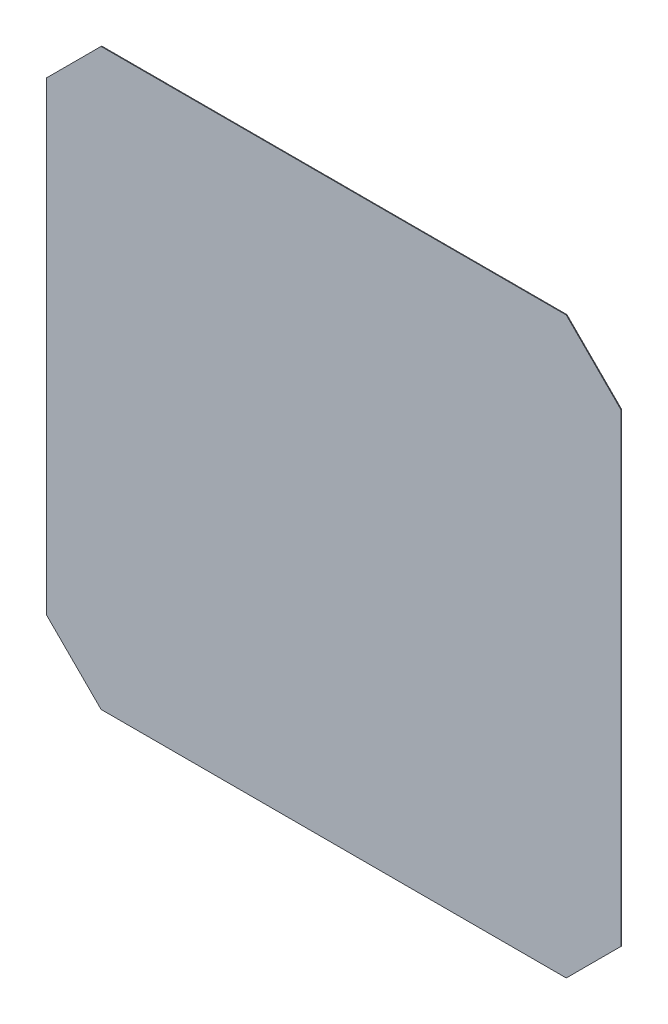
ISO-10303-21;
HEADER;
FILE_DESCRIPTION(('STEP AP214'),'2;1');
FILE_NAME('part.step','',(''),(''),'','','');
FILE_SCHEMA(('AUTOMOTIVE_DESIGN { 1 0 10303 214 1 1 1 1 }'));
ENDSEC;
DATA;
#1=APPLICATION_CONTEXT('core data for automotive mechanical design processes');
#2=APPLICATION_PROTOCOL_DEFINITION('international standard','automotive_design',2000,#1);
#3=PRODUCT_CONTEXT('',#1,'mechanical');
#4=PRODUCT('Part','Part','',(#3));
#5=PRODUCT_RELATED_PRODUCT_CATEGORY('part','',(#4));
#6=PRODUCT_DEFINITION_FORMATION('','',#4);
#7=PRODUCT_DEFINITION_CONTEXT('part definition',#1,'design');
#8=PRODUCT_DEFINITION('design','',#6,#7);
#9=PRODUCT_DEFINITION_SHAPE('','',#8);
#10=(LENGTH_UNIT() NAMED_UNIT(*) SI_UNIT(.MILLI.,.METRE.));
#11=(NAMED_UNIT(*) PLANE_ANGLE_UNIT() SI_UNIT($,.RADIAN.));
#12=(NAMED_UNIT(*) SI_UNIT($,.STERADIAN.) SOLID_ANGLE_UNIT());
#13=UNCERTAINTY_MEASURE_WITH_UNIT(LENGTH_MEASURE(1.E-05),#10,'distance_accuracy_value','');
#14=(GEOMETRIC_REPRESENTATION_CONTEXT(3) GLOBAL_UNCERTAINTY_ASSIGNED_CONTEXT((#13)) GLOBAL_UNIT_ASSIGNED_CONTEXT((#10,
#11,#12)) REPRESENTATION_CONTEXT('',''));
#15=CARTESIAN_POINT('',(0.,0.,0.));
#16=DIRECTION('',(0.,0.,1.));
#17=DIRECTION('',(1.,0.,0.));
#18=AXIS2_PLACEMENT_3D('',#15,#16,#17);
#19=CARTESIAN_POINT('',(0.,0.,0.));
#20=DIRECTION('',(0.,0.,-1.));
#21=DIRECTION('',(-1.,0.,0.));
#22=AXIS2_PLACEMENT_3D('',#19,#20,#21);
#23=PLANE('',#22);
#24=DIRECTION('',(0.,-1.,0.));
#25=VECTOR('',#24,1.);
#26=CARTESIAN_POINT('',(-40.,-57.1,0.));
#27=LINE('',#26,#25);
#28=CARTESIAN_POINT('',(-40.,-57.1,0.));
#29=VERTEX_POINT('',#28);
#30=CARTESIAN_POINT('',(-40.,-62.5,0.));
#31=VERTEX_POINT('',#30);
#32=EDGE_CURVE('E259',#29,#31,#27,.T.);
#33=ORIENTED_EDGE('',*,*,#32,.T.);
#34=DIRECTION('',(1.,0.,0.));
#35=VECTOR('',#34,1.);
#36=CARTESIAN_POINT('',(-62.5,-62.5,0.));
#37=LINE('',#36,#35);
#38=CARTESIAN_POINT('',(-50.6370849898476,-62.5,0.));
#39=VERTEX_POINT('',#38);
#40=EDGE_CURVE('E45',#39,#31,#37,.T.);
#41=ORIENTED_EDGE('',*,*,#40,.F.);
#42=DIRECTION('',(0.707106781186547,-0.707106781186548,0.));
#43=VECTOR('',#42,1.);
#44=CARTESIAN_POINT('',(-62.5000000000006,-50.637084989847,0.));
#45=LINE('',#44,#43);
#46=CARTESIAN_POINT('',(-62.5,-50.6370849898476,0.));
#47=VERTEX_POINT('',#46);
#48=EDGE_CURVE('E525',#47,#39,#45,.T.);
#49=ORIENTED_EDGE('',*,*,#48,.F.);
#50=DIRECTION('',(0.,-1.,0.));
#51=VECTOR('',#50,1.);
#52=CARTESIAN_POINT('',(-62.5,-62.5,0.));
#53=LINE('',#52,#51);
#54=CARTESIAN_POINT('',(-62.5000000000006,50.637084989847,0.));
#55=VERTEX_POINT('',#54);
#56=EDGE_CURVE('E571',#55,#47,#53,.T.);
#57=ORIENTED_EDGE('',*,*,#56,.F.);
#58=DIRECTION('',(0.707106781186547,0.707106781186548,0.));
#59=VECTOR('',#58,1.);
#60=CARTESIAN_POINT('',(-62.5000000000006,50.637084989847,0.));
#61=LINE('',#60,#59);
#62=CARTESIAN_POINT('',(-50.6370849898476,62.5,0.));
#63=VERTEX_POINT('',#62);
#64=EDGE_CURVE('E539',#55,#63,#61,.T.);
#65=ORIENTED_EDGE('',*,*,#64,.T.);
#66=DIRECTION('',(-1.,0.,0.));
#67=VECTOR('',#66,1.);
#68=CARTESIAN_POINT('',(-62.5,62.5,0.));
#69=LINE('',#68,#67);
#70=CARTESIAN_POINT('',(-40.,62.5,0.));
#71=VERTEX_POINT('',#70);
#72=EDGE_CURVE('E567',#71,#63,#69,.T.);
#73=ORIENTED_EDGE('',*,*,#72,.F.);
#74=DIRECTION('',(0.,1.,0.));
#75=VECTOR('',#74,1.);
#76=CARTESIAN_POINT('',(-40.,57.1,0.));
#77=LINE('',#76,#75);
#78=CARTESIAN_POINT('',(-40.,57.1,0.));
#79=VERTEX_POINT('',#78);
#80=EDGE_CURVE('E381',#79,#71,#77,.T.);
#81=ORIENTED_EDGE('',*,*,#80,.F.);
#82=DIRECTION('',(-1.,0.,0.));
#83=VECTOR('',#82,1.);
#84=CARTESIAN_POINT('',(-37.,57.1,0.));
#85=LINE('',#84,#83);
#86=CARTESIAN_POINT('',(-37.,57.1,0.));
#87=VERTEX_POINT('',#86);
#88=EDGE_CURVE('E387',#87,#79,#85,.T.);
#89=ORIENTED_EDGE('',*,*,#88,.F.);
#90=DIRECTION('',(0.,-1.,0.));
#91=VECTOR('',#90,1.);
#92=CARTESIAN_POINT('',(-37.,57.1,0.));
#93=LINE('',#92,#91);
#94=CARTESIAN_POINT('',(-37.,62.5,0.));
#95=VERTEX_POINT('',#94);
#96=EDGE_CURVE('E399',#95,#87,#93,.T.);
#97=ORIENTED_EDGE('',*,*,#96,.F.);
#98=CARTESIAN_POINT('',(-1.49999999999999,62.5,0.));
#99=VERTEX_POINT('',#98);
#100=EDGE_CURVE('E573',#99,#95,#69,.T.);
#101=ORIENTED_EDGE('',*,*,#100,.F.);
#102=DIRECTION('',(0.,1.,0.));
#103=VECTOR('',#102,1.);
#104=CARTESIAN_POINT('',(-1.49999999999999,57.1,0.));
#105=LINE('',#104,#103);
#106=CARTESIAN_POINT('',(-1.49999999999999,57.1,0.));
#107=VERTEX_POINT('',#106);
#108=EDGE_CURVE('E455',#107,#99,#105,.T.);
#109=ORIENTED_EDGE('',*,*,#108,.F.);
#110=DIRECTION('',(-1.,0.,0.));
#111=VECTOR('',#110,1.);
#112=CARTESIAN_POINT('',(1.50000000000001,57.1,0.));
#113=LINE('',#112,#111);
#114=CARTESIAN_POINT('',(1.50000000000001,57.1,0.));
#115=VERTEX_POINT('',#114);
#116=EDGE_CURVE('E461',#115,#107,#113,.T.);
#117=ORIENTED_EDGE('',*,*,#116,.F.);
#118=DIRECTION('',(0.,-1.,0.));
#119=VECTOR('',#118,1.);
#120=CARTESIAN_POINT('',(1.50000000000001,57.1,0.));
#121=LINE('',#120,#119);
#122=CARTESIAN_POINT('',(1.50000000000001,62.5,0.));
#123=VERTEX_POINT('',#122);
#124=EDGE_CURVE('E474',#123,#115,#121,.T.);
#125=ORIENTED_EDGE('',*,*,#124,.F.);
#126=CARTESIAN_POINT('',(37.,62.5,0.));
#127=VERTEX_POINT('',#126);
#128=EDGE_CURVE('E572',#127,#123,#69,.T.);
#129=ORIENTED_EDGE('',*,*,#128,.F.);
#130=DIRECTION('',(0.,1.,0.));
#131=VECTOR('',#130,1.);
#132=CARTESIAN_POINT('',(37.,57.1,0.));
#133=LINE('',#132,#131);
#134=CARTESIAN_POINT('',(37.,57.1,0.));
#135=VERTEX_POINT('',#134);
#136=EDGE_CURVE('E418',#135,#127,#133,.T.);
#137=ORIENTED_EDGE('',*,*,#136,.F.);
#138=DIRECTION('',(-1.,0.,0.));
#139=VECTOR('',#138,1.);
#140=CARTESIAN_POINT('',(40.,57.1,0.));
#141=LINE('',#140,#139);
#142=CARTESIAN_POINT('',(40.,57.1,0.));
#143=VERTEX_POINT('',#142);
#144=EDGE_CURVE('E424',#143,#135,#141,.T.);
#145=ORIENTED_EDGE('',*,*,#144,.F.);
#146=DIRECTION('',(0.,-1.,0.));
#147=VECTOR('',#146,1.);
#148=CARTESIAN_POINT('',(40.,57.1,0.));
#149=LINE('',#148,#147);
#150=CARTESIAN_POINT('',(40.,62.5,0.));
#151=VERTEX_POINT('',#150);
#152=EDGE_CURVE('E436',#151,#143,#149,.T.);
#153=ORIENTED_EDGE('',*,*,#152,.F.);
#154=CARTESIAN_POINT('',(50.6370849898476,62.5,0.));
#155=VERTEX_POINT('',#154);
#156=EDGE_CURVE('E568',#155,#151,#69,.T.);
#157=ORIENTED_EDGE('',*,*,#156,.F.);
#158=DIRECTION('',(-0.707106781186547,0.707106781186548,0.));
#159=VECTOR('',#158,1.);
#160=CARTESIAN_POINT('',(62.5000000000006,50.637084989847,0.));
#161=LINE('',#160,#159);
#162=CARTESIAN_POINT('',(62.5000000000006,50.637084989847,0.));
#163=VERTEX_POINT('',#162);
#164=EDGE_CURVE('E497',#163,#155,#161,.T.);
#165=ORIENTED_EDGE('',*,*,#164,.F.);
#166=DIRECTION('',(0.,1.,0.));
#167=VECTOR('',#166,1.);
#168=CARTESIAN_POINT('',(62.5,-62.5,0.));
#169=LINE('',#168,#167);
#170=CARTESIAN_POINT('',(62.5,-50.637084989847,0.));
#171=VERTEX_POINT('',#170);
#172=EDGE_CURVE('E551',#171,#163,#169,.T.);
#173=ORIENTED_EDGE('',*,*,#172,.F.);
#174=DIRECTION('',(-0.707106781186547,-0.707106781186548,0.));
#175=VECTOR('',#174,1.);
#176=CARTESIAN_POINT('',(62.5000000000006,-50.637084989847,0.));
#177=LINE('',#176,#175);
#178=CARTESIAN_POINT('',(50.6370849898476,-62.5,0.));
#179=VERTEX_POINT('',#178);
#180=EDGE_CURVE('E511',#171,#179,#177,.T.);
#181=ORIENTED_EDGE('',*,*,#180,.T.);
#182=CARTESIAN_POINT('',(40.,-62.5,0.));
#183=VERTEX_POINT('',#182);
#184=EDGE_CURVE('E576',#183,#179,#37,.T.);
#185=ORIENTED_EDGE('',*,*,#184,.F.);
#186=DIRECTION('',(0.,1.,0.));
#187=VECTOR('',#186,1.);
#188=CARTESIAN_POINT('',(40.,-57.1,0.));
#189=LINE('',#188,#187);
#190=CARTESIAN_POINT('',(40.,-57.1,0.));
#191=VERTEX_POINT('',#190);
#192=EDGE_CURVE('E67',#183,#191,#189,.T.);
#193=ORIENTED_EDGE('',*,*,#192,.T.);
#194=DIRECTION('',(-1.,0.,0.));
#195=VECTOR('',#194,1.);
#196=CARTESIAN_POINT('',(40.,-57.1,0.));
#197=LINE('',#196,#195);
#198=CARTESIAN_POINT('',(37.,-57.1,0.));
#199=VERTEX_POINT('',#198);
#200=EDGE_CURVE('E322',#191,#199,#197,.T.);
#201=ORIENTED_EDGE('',*,*,#200,.T.);
#202=DIRECTION('',(0.,-1.,0.));
#203=VECTOR('',#202,1.);
#204=CARTESIAN_POINT('',(37.,-57.1,0.));
#205=LINE('',#204,#203);
#206=CARTESIAN_POINT('',(37.,-62.5,0.));
#207=VERTEX_POINT('',#206);
#208=EDGE_CURVE('E265',#199,#207,#205,.T.);
#209=ORIENTED_EDGE('',*,*,#208,.T.);
#210=CARTESIAN_POINT('',(1.50000000000001,-62.5,0.));
#211=VERTEX_POINT('',#210);
#212=EDGE_CURVE('E581',#211,#207,#37,.T.);
#213=ORIENTED_EDGE('',*,*,#212,.F.);
#214=DIRECTION('',(0.,1.,0.));
#215=VECTOR('',#214,1.);
#216=CARTESIAN_POINT('',(1.50000000000001,-57.1,0.));
#217=LINE('',#216,#215);
#218=CARTESIAN_POINT('',(1.50000000000001,-57.1,0.));
#219=VERTEX_POINT('',#218);
#220=EDGE_CURVE('E345',#211,#219,#217,.T.);
#221=ORIENTED_EDGE('',*,*,#220,.T.);
#222=DIRECTION('',(-1.,0.,0.));
#223=VECTOR('',#222,1.);
#224=CARTESIAN_POINT('',(1.50000000000001,-57.1,0.));
#225=LINE('',#224,#223);
#226=CARTESIAN_POINT('',(-1.49999999999999,-57.1,0.));
#227=VERTEX_POINT('',#226);
#228=EDGE_CURVE('E361',#219,#227,#225,.T.);
#229=ORIENTED_EDGE('',*,*,#228,.T.);
#230=DIRECTION('',(0.,-1.,0.));
#231=VECTOR('',#230,1.);
#232=CARTESIAN_POINT('',(-1.49999999999999,-57.1,0.));
#233=LINE('',#232,#231);
#234=CARTESIAN_POINT('',(-1.49999999999999,-62.5,0.));
#235=VERTEX_POINT('',#234);
#236=EDGE_CURVE('E339',#227,#235,#233,.T.);
#237=ORIENTED_EDGE('',*,*,#236,.T.);
#238=CARTESIAN_POINT('',(-37.,-62.5,0.));
#239=VERTEX_POINT('',#238);
#240=EDGE_CURVE('E582',#239,#235,#37,.T.);
#241=ORIENTED_EDGE('',*,*,#240,.F.);
#242=DIRECTION('',(0.,1.,0.));
#243=VECTOR('',#242,1.);
#244=CARTESIAN_POINT('',(-37.,-57.1,0.));
#245=LINE('',#244,#243);
#246=CARTESIAN_POINT('',(-37.,-57.1,0.));
#247=VERTEX_POINT('',#246);
#248=EDGE_CURVE('E59',#239,#247,#245,.T.);
#249=ORIENTED_EDGE('',*,*,#248,.T.);
#250=DIRECTION('',(-1.,0.,0.));
#251=VECTOR('',#250,1.);
#252=CARTESIAN_POINT('',(-37.,-57.1,0.));
#253=LINE('',#252,#251);
#254=EDGE_CURVE('E290',#247,#29,#253,.T.);
#255=ORIENTED_EDGE('',*,*,#254,.T.);
#256=EDGE_LOOP('',(#33,#41,#49,#57,#65,#73,#81,#89,#97,#101,#109,#117,#125,#129,#137,#145,#153,
#157,#165,#173,#181,#185,#193,#201,#209,#213,#221,#229,#237,#241,#249,#255));
#257=FACE_BOUND('',#256,.T.);
#258=ADVANCED_FACE('F41',(#257),#23,.T.);
#259=CARTESIAN_POINT('',(0.,0.,0.15));
#260=DIRECTION('',(0.,0.,-1.));
#261=DIRECTION('',(-1.,0.,0.));
#262=AXIS2_PLACEMENT_3D('',#259,#260,#261);
#263=PLANE('',#262);
#264=DIRECTION('',(-0.707106781186547,0.707106781186548,0.));
#265=VECTOR('',#264,1.);
#266=CARTESIAN_POINT('',(62.5000000000006,50.637084989847,0.15));
#267=LINE('',#266,#265);
#268=CARTESIAN_POINT('',(62.5000000000006,50.637084989847,0.15));
#269=VERTEX_POINT('',#268);
#270=CARTESIAN_POINT('',(50.6370849898476,62.5,0.15));
#271=VERTEX_POINT('',#270);
#272=EDGE_CURVE('E496',#269,#271,#267,.T.);
#273=ORIENTED_EDGE('',*,*,#272,.T.);
#274=DIRECTION('',(-1.,0.,0.));
#275=VECTOR('',#274,1.);
#276=CARTESIAN_POINT('',(-62.5,62.5,0.15));
#277=LINE('',#276,#275);
#278=CARTESIAN_POINT('',(-50.6370849898476,62.5,0.15));
#279=VERTEX_POINT('',#278);
#280=EDGE_CURVE('E558',#271,#279,#277,.T.);
#281=ORIENTED_EDGE('',*,*,#280,.T.);
#282=DIRECTION('',(0.707106781186547,0.707106781186548,0.));
#283=VECTOR('',#282,1.);
#284=CARTESIAN_POINT('',(-62.5000000000006,50.637084989847,0.15));
#285=LINE('',#284,#283);
#286=CARTESIAN_POINT('',(-62.5000000000006,50.637084989847,0.15));
#287=VERTEX_POINT('',#286);
#288=EDGE_CURVE('E536',#287,#279,#285,.T.);
#289=ORIENTED_EDGE('',*,*,#288,.F.);
#290=DIRECTION('',(0.,-1.,0.));
#291=VECTOR('',#290,1.);
#292=CARTESIAN_POINT('',(-62.5,-62.5,0.15));
#293=LINE('',#292,#291);
#294=CARTESIAN_POINT('',(-62.5000000000006,-50.637084989847,0.15));
#295=VERTEX_POINT('',#294);
#296=EDGE_CURVE('E51',#287,#295,#293,.T.);
#297=ORIENTED_EDGE('',*,*,#296,.T.);
#298=DIRECTION('',(0.707106781186547,-0.707106781186548,0.));
#299=VECTOR('',#298,1.);
#300=CARTESIAN_POINT('',(-62.5000000000006,-50.637084989847,0.15));
#301=LINE('',#300,#299);
#302=CARTESIAN_POINT('',(-50.6370849898476,-62.5,0.15));
#303=VERTEX_POINT('',#302);
#304=EDGE_CURVE('E522',#295,#303,#301,.T.);
#305=ORIENTED_EDGE('',*,*,#304,.T.);
#306=DIRECTION('',(1.,0.,0.));
#307=VECTOR('',#306,1.);
#308=CARTESIAN_POINT('',(-62.5,-62.5,0.15));
#309=LINE('',#308,#307);
#310=CARTESIAN_POINT('',(50.6370849898476,-62.5,0.15));
#311=VERTEX_POINT('',#310);
#312=EDGE_CURVE('E11',#303,#311,#309,.T.);
#313=ORIENTED_EDGE('',*,*,#312,.T.);
#314=DIRECTION('',(-0.707106781186547,-0.707106781186548,0.));
#315=VECTOR('',#314,1.);
#316=CARTESIAN_POINT('',(62.5000000000006,-50.637084989847,0.15));
#317=LINE('',#316,#315);
#318=CARTESIAN_POINT('',(62.5000000000006,-50.637084989847,0.15));
#319=VERTEX_POINT('',#318);
#320=EDGE_CURVE('E508',#319,#311,#317,.T.);
#321=ORIENTED_EDGE('',*,*,#320,.F.);
#322=DIRECTION('',(0.,1.,0.));
#323=VECTOR('',#322,1.);
#324=CARTESIAN_POINT('',(62.5,-62.5,0.15));
#325=LINE('',#324,#323);
#326=EDGE_CURVE('E554',#319,#269,#325,.T.);
#327=ORIENTED_EDGE('',*,*,#326,.T.);
#328=EDGE_LOOP('',(#273,#281,#289,#297,#305,#313,#321,#327));
#329=FACE_BOUND('',#328,.T.);
#330=ADVANCED_FACE('F631',(#329),#263,.F.);
#331=CARTESIAN_POINT('',(62.5,-62.5,0.15));
#332=DIRECTION('',(-1.,0.,0.));
#333=DIRECTION('',(0.,0.,1.));
#334=AXIS2_PLACEMENT_3D('',#331,#332,#333);
#335=PLANE('',#334);
#336=DIRECTION('',(0.,0.,1.));
#337=VECTOR('',#336,1.);
#338=CARTESIAN_POINT('',(62.5000000000006,50.637084989847,0.));
#339=LINE('',#338,#337);
#340=EDGE_CURVE('E504',#163,#269,#339,.T.);
#341=ORIENTED_EDGE('',*,*,#340,.T.);
#342=ORIENTED_EDGE('',*,*,#326,.F.);
#343=DIRECTION('',(0.,0.,1.));
#344=VECTOR('',#343,1.);
#345=CARTESIAN_POINT('',(62.5000000000006,-50.637084989847,0.));
#346=LINE('',#345,#344);
#347=EDGE_CURVE('E515',#171,#319,#346,.T.);
#348=ORIENTED_EDGE('',*,*,#347,.F.);
#349=ORIENTED_EDGE('',*,*,#172,.T.);
#350=EDGE_LOOP('',(#341,#342,#348,#349));
#351=FACE_BOUND('',#350,.T.);
#352=ADVANCED_FACE('F43',(#351),#335,.F.);
#353=CARTESIAN_POINT('',(-62.5,62.5,0.15));
#354=DIRECTION('',(0.,-1.,0.));
#355=DIRECTION('',(0.,0.,-1.));
#356=AXIS2_PLACEMENT_3D('',#353,#354,#355);
#357=PLANE('',#356);
#358=ORIENTED_EDGE('',*,*,#128,.T.);
#359=DIRECTION('',(0.,0.,1.));
#360=VECTOR('',#359,1.);
#361=CARTESIAN_POINT('',(1.50000000000001,62.5,-0.01));
#362=LINE('',#361,#360);
#363=CARTESIAN_POINT('',(1.50000000000001,62.5,-0.01));
#364=VERTEX_POINT('',#363);
#365=EDGE_CURVE('E488',#364,#123,#362,.T.);
#366=ORIENTED_EDGE('',*,*,#365,.F.);
#367=DIRECTION('',(1.,0.,0.));
#368=VECTOR('',#367,1.);
#369=CARTESIAN_POINT('',(1.50000000000001,62.5,-0.01));
#370=LINE('',#369,#368);
#371=CARTESIAN_POINT('',(-1.49999999999999,62.5,-0.01));
#372=VERTEX_POINT('',#371);
#373=EDGE_CURVE('E460',#372,#364,#370,.T.);
#374=ORIENTED_EDGE('',*,*,#373,.F.);
#375=DIRECTION('',(0.,0.,1.));
#376=VECTOR('',#375,1.);
#377=CARTESIAN_POINT('',(-1.49999999999999,62.5,-0.01));
#378=LINE('',#377,#376);
#379=EDGE_CURVE('E492',#372,#99,#378,.T.);
#380=ORIENTED_EDGE('',*,*,#379,.T.);
#381=ORIENTED_EDGE('',*,*,#100,.T.);
#382=DIRECTION('',(0.,0.,1.));
#383=VECTOR('',#382,1.);
#384=CARTESIAN_POINT('',(-37.,62.5,-0.01));
#385=LINE('',#384,#383);
#386=CARTESIAN_POINT('',(-37.,62.5,-0.01));
#387=VERTEX_POINT('',#386);
#388=EDGE_CURVE('E411',#387,#95,#385,.T.);
#389=ORIENTED_EDGE('',*,*,#388,.F.);
#390=DIRECTION('',(1.,0.,0.));
#391=VECTOR('',#390,1.);
#392=CARTESIAN_POINT('',(-37.,62.5,-0.01));
#393=LINE('',#392,#391);
#394=CARTESIAN_POINT('',(-40.,62.5,-0.01));
#395=VERTEX_POINT('',#394);
#396=EDGE_CURVE('E386',#395,#387,#393,.T.);
#397=ORIENTED_EDGE('',*,*,#396,.F.);
#398=DIRECTION('',(0.,0.,1.));
#399=VECTOR('',#398,1.);
#400=CARTESIAN_POINT('',(-40.,62.5,-0.01));
#401=LINE('',#400,#399);
#402=EDGE_CURVE('E414',#395,#71,#401,.T.);
#403=ORIENTED_EDGE('',*,*,#402,.T.);
#404=ORIENTED_EDGE('',*,*,#72,.T.);
#405=DIRECTION('',(0.,0.,1.));
#406=VECTOR('',#405,1.);
#407=CARTESIAN_POINT('',(-50.6370849898476,62.5,0.));
#408=LINE('',#407,#406);
#409=EDGE_CURVE('E547',#63,#279,#408,.T.);
#410=ORIENTED_EDGE('',*,*,#409,.T.);
#411=ORIENTED_EDGE('',*,*,#280,.F.);
#412=DIRECTION('',(0.,0.,1.));
#413=VECTOR('',#412,1.);
#414=CARTESIAN_POINT('',(50.6370849898476,62.5,0.));
#415=LINE('',#414,#413);
#416=EDGE_CURVE('E500',#155,#271,#415,.T.);
#417=ORIENTED_EDGE('',*,*,#416,.F.);
#418=ORIENTED_EDGE('',*,*,#156,.T.);
#419=DIRECTION('',(0.,0.,1.));
#420=VECTOR('',#419,1.);
#421=CARTESIAN_POINT('',(40.,62.5,-0.01));
#422=LINE('',#421,#420);
#423=CARTESIAN_POINT('',(40.,62.5,-0.01));
#424=VERTEX_POINT('',#423);
#425=EDGE_CURVE('E448',#424,#151,#422,.T.);
#426=ORIENTED_EDGE('',*,*,#425,.F.);
#427=DIRECTION('',(1.,0.,0.));
#428=VECTOR('',#427,1.);
#429=CARTESIAN_POINT('',(40.,62.5,-0.01));
#430=LINE('',#429,#428);
#431=CARTESIAN_POINT('',(37.,62.5,-0.01));
#432=VERTEX_POINT('',#431);
#433=EDGE_CURVE('E423',#432,#424,#430,.T.);
#434=ORIENTED_EDGE('',*,*,#433,.F.);
#435=DIRECTION('',(0.,0.,1.));
#436=VECTOR('',#435,1.);
#437=CARTESIAN_POINT('',(37.,62.5,-0.01));
#438=LINE('',#437,#436);
#439=EDGE_CURVE('E451',#432,#127,#438,.T.);
#440=ORIENTED_EDGE('',*,*,#439,.T.);
#441=EDGE_LOOP('',(#358,#366,#374,#380,#381,#389,#397,#403,#404,#410,#411,#417,#418,#426,#434,#440));
#442=FACE_BOUND('',#441,.T.);
#443=ADVANCED_FACE('F644',(#442),#357,.F.);
#444=CARTESIAN_POINT('',(-62.5,-62.5,0.15));
#445=DIRECTION('',(1.,0.,0.));
#446=DIRECTION('',(0.,0.,-1.));
#447=AXIS2_PLACEMENT_3D('',#444,#445,#446);
#448=PLANE('',#447);
#449=DIRECTION('',(0.,0.,1.));
#450=VECTOR('',#449,1.);
#451=CARTESIAN_POINT('',(-62.5000000000006,-50.637084989847,0.));
#452=LINE('',#451,#450);
#453=EDGE_CURVE('E532',#47,#295,#452,.T.);
#454=ORIENTED_EDGE('',*,*,#453,.T.);
#455=ORIENTED_EDGE('',*,*,#296,.F.);
#456=DIRECTION('',(0.,0.,1.));
#457=VECTOR('',#456,1.);
#458=CARTESIAN_POINT('',(-62.5000000000006,50.637084989847,0.));
#459=LINE('',#458,#457);
#460=EDGE_CURVE('E543',#55,#287,#459,.T.);
#461=ORIENTED_EDGE('',*,*,#460,.F.);
#462=ORIENTED_EDGE('',*,*,#56,.T.);
#463=EDGE_LOOP('',(#454,#455,#461,#462));
#464=FACE_BOUND('',#463,.T.);
#465=ADVANCED_FACE('F637',(#464),#448,.F.);
#466=CARTESIAN_POINT('',(-62.5,-62.5,0.15));
#467=DIRECTION('',(0.,1.,0.));
#468=DIRECTION('',(0.,0.,1.));
#469=AXIS2_PLACEMENT_3D('',#466,#467,#468);
#470=PLANE('',#469);
#471=ORIENTED_EDGE('',*,*,#40,.T.);
#472=DIRECTION('',(0.,0.,1.));
#473=VECTOR('',#472,1.);
#474=CARTESIAN_POINT('',(-40.,-62.5,-0.01));
#475=LINE('',#474,#473);
#476=CARTESIAN_POINT('',(-40.,-62.5,-0.01));
#477=VERTEX_POINT('',#476);
#478=EDGE_CURVE('E287',#477,#31,#475,.T.);
#479=ORIENTED_EDGE('',*,*,#478,.F.);
#480=DIRECTION('',(1.,0.,0.));
#481=VECTOR('',#480,1.);
#482=CARTESIAN_POINT('',(-37.,-62.5,-0.01));
#483=LINE('',#482,#481);
#484=CARTESIAN_POINT('',(-37.,-62.5,-0.01));
#485=VERTEX_POINT('',#484);
#486=EDGE_CURVE('E275',#477,#485,#483,.T.);
#487=ORIENTED_EDGE('',*,*,#486,.T.);
#488=DIRECTION('',(0.,0.,1.));
#489=VECTOR('',#488,1.);
#490=CARTESIAN_POINT('',(-37.,-62.5,-0.01));
#491=LINE('',#490,#489);
#492=EDGE_CURVE('E297',#485,#239,#491,.T.);
#493=ORIENTED_EDGE('',*,*,#492,.T.);
#494=ORIENTED_EDGE('',*,*,#240,.T.);
#495=DIRECTION('',(0.,0.,1.));
#496=VECTOR('',#495,1.);
#497=CARTESIAN_POINT('',(-1.49999999999999,-62.5,-0.01));
#498=LINE('',#497,#496);
#499=CARTESIAN_POINT('',(-1.49999999999999,-62.5,-0.01));
#500=VERTEX_POINT('',#499);
#501=EDGE_CURVE('E357',#500,#235,#498,.T.);
#502=ORIENTED_EDGE('',*,*,#501,.F.);
#503=DIRECTION('',(1.,0.,0.));
#504=VECTOR('',#503,1.);
#505=CARTESIAN_POINT('',(1.50000000000001,-62.5,-0.01));
#506=LINE('',#505,#504);
#507=CARTESIAN_POINT('',(1.50000000000001,-62.5,-0.01));
#508=VERTEX_POINT('',#507);
#509=EDGE_CURVE('E353',#500,#508,#506,.T.);
#510=ORIENTED_EDGE('',*,*,#509,.T.);
#511=DIRECTION('',(0.,0.,1.));
#512=VECTOR('',#511,1.);
#513=CARTESIAN_POINT('',(1.50000000000001,-62.5,-0.01));
#514=LINE('',#513,#512);
#515=EDGE_CURVE('E371',#508,#211,#514,.T.);
#516=ORIENTED_EDGE('',*,*,#515,.T.);
#517=ORIENTED_EDGE('',*,*,#212,.T.);
#518=DIRECTION('',(0.,0.,1.));
#519=VECTOR('',#518,1.);
#520=CARTESIAN_POINT('',(37.,-62.5,-0.01));
#521=LINE('',#520,#519);
#522=CARTESIAN_POINT('',(37.,-62.5,-0.01));
#523=VERTEX_POINT('',#522);
#524=EDGE_CURVE('E318',#523,#207,#521,.T.);
#525=ORIENTED_EDGE('',*,*,#524,.F.);
#526=DIRECTION('',(1.,0.,0.));
#527=VECTOR('',#526,1.);
#528=CARTESIAN_POINT('',(40.,-62.5,-0.01));
#529=LINE('',#528,#527);
#530=CARTESIAN_POINT('',(40.,-62.5,-0.01));
#531=VERTEX_POINT('',#530);
#532=EDGE_CURVE('E314',#523,#531,#529,.T.);
#533=ORIENTED_EDGE('',*,*,#532,.T.);
#534=DIRECTION('',(0.,0.,1.));
#535=VECTOR('',#534,1.);
#536=CARTESIAN_POINT('',(40.,-62.5,-0.01));
#537=LINE('',#536,#535);
#538=EDGE_CURVE('E330',#531,#183,#537,.T.);
#539=ORIENTED_EDGE('',*,*,#538,.T.);
#540=ORIENTED_EDGE('',*,*,#184,.T.);
#541=DIRECTION('',(0.,0.,1.));
#542=VECTOR('',#541,1.);
#543=CARTESIAN_POINT('',(50.6370849898476,-62.5,0.));
#544=LINE('',#543,#542);
#545=EDGE_CURVE('E518',#179,#311,#544,.T.);
#546=ORIENTED_EDGE('',*,*,#545,.T.);
#547=ORIENTED_EDGE('',*,*,#312,.F.);
#548=DIRECTION('',(0.,0.,1.));
#549=VECTOR('',#548,1.);
#550=CARTESIAN_POINT('',(-50.6370849898476,-62.5,0.));
#551=LINE('',#550,#549);
#552=EDGE_CURVE('E528',#39,#303,#551,.T.);
#553=ORIENTED_EDGE('',*,*,#552,.F.);
#554=EDGE_LOOP('',(#471,#479,#487,#493,#494,#502,#510,#516,#517,#525,#533,#539,#540,#546,#547,#553));
#555=FACE_BOUND('',#554,.T.);
#556=ADVANCED_FACE('F594',(#555),#470,.F.);
#557=CARTESIAN_POINT('',(-62.5000000000006,50.637084989847,0.));
#558=DIRECTION('',(0.707106781186548,-0.707106781186547,0.));
#559=DIRECTION('',(0.707106781186547,0.707106781186548,0.));
#560=AXIS2_PLACEMENT_3D('',#557,#558,#559);
#561=PLANE('',#560);
#562=ORIENTED_EDGE('',*,*,#288,.T.);
#563=ORIENTED_EDGE('',*,*,#409,.F.);
#564=ORIENTED_EDGE('',*,*,#64,.F.);
#565=ORIENTED_EDGE('',*,*,#460,.T.);
#566=EDGE_LOOP('',(#562,#563,#564,#565));
#567=FACE_BOUND('',#566,.T.);
#568=ADVANCED_FACE('F642',(#567),#561,.F.);
#569=CARTESIAN_POINT('',(-62.5000000000006,-50.637084989847,0.));
#570=DIRECTION('',(-0.707106781186548,-0.707106781186547,0.));
#571=DIRECTION('',(0.707106781186547,-0.707106781186548,0.));
#572=AXIS2_PLACEMENT_3D('',#569,#570,#571);
#573=PLANE('',#572);
#574=ORIENTED_EDGE('',*,*,#304,.F.);
#575=ORIENTED_EDGE('',*,*,#453,.F.);
#576=ORIENTED_EDGE('',*,*,#48,.T.);
#577=ORIENTED_EDGE('',*,*,#552,.T.);
#578=EDGE_LOOP('',(#574,#575,#576,#577));
#579=FACE_BOUND('',#578,.T.);
#580=ADVANCED_FACE('F636',(#579),#573,.T.);
#581=CARTESIAN_POINT('',(62.5000000000006,-50.637084989847,0.));
#582=DIRECTION('',(-0.707106781186548,0.707106781186547,0.));
#583=DIRECTION('',(-0.707106781186547,-0.707106781186548,0.));
#584=AXIS2_PLACEMENT_3D('',#581,#582,#583);
#585=PLANE('',#584);
#586=ORIENTED_EDGE('',*,*,#320,.T.);
#587=ORIENTED_EDGE('',*,*,#545,.F.);
#588=ORIENTED_EDGE('',*,*,#180,.F.);
#589=ORIENTED_EDGE('',*,*,#347,.T.);
#590=EDGE_LOOP('',(#586,#587,#588,#589));
#591=FACE_BOUND('',#590,.T.);
#592=ADVANCED_FACE('F626',(#591),#585,.F.);
#593=CARTESIAN_POINT('',(62.5000000000006,50.637084989847,0.));
#594=DIRECTION('',(0.707106781186548,0.707106781186547,0.));
#595=DIRECTION('',(-0.707106781186547,0.707106781186548,0.));
#596=AXIS2_PLACEMENT_3D('',#593,#594,#595);
#597=PLANE('',#596);
#598=ORIENTED_EDGE('',*,*,#272,.F.);
#599=ORIENTED_EDGE('',*,*,#340,.F.);
#600=ORIENTED_EDGE('',*,*,#164,.T.);
#601=ORIENTED_EDGE('',*,*,#416,.T.);
#602=EDGE_LOOP('',(#598,#599,#600,#601));
#603=FACE_BOUND('',#602,.T.);
#604=ADVANCED_FACE('F891',(#603),#597,.T.);
#605=CARTESIAN_POINT('',(-1.49999999999999,57.1,-0.01));
#606=DIRECTION('',(1.,0.,0.));
#607=DIRECTION('',(0.,0.,-1.));
#608=AXIS2_PLACEMENT_3D('',#605,#606,#607);
#609=PLANE('',#608);
#610=ORIENTED_EDGE('',*,*,#108,.T.);
#611=ORIENTED_EDGE('',*,*,#379,.F.);
#612=DIRECTION('',(0.,1.,0.));
#613=VECTOR('',#612,1.);
#614=CARTESIAN_POINT('',(-1.49999999999999,57.1,-0.01));
#615=LINE('',#614,#613);
#616=CARTESIAN_POINT('',(-1.49999999999999,57.1,-0.01));
#617=VERTEX_POINT('',#616);
#618=EDGE_CURVE('E456',#617,#372,#615,.T.);
#619=ORIENTED_EDGE('',*,*,#618,.F.);
#620=DIRECTION('',(0.,0.,1.));
#621=VECTOR('',#620,1.);
#622=CARTESIAN_POINT('',(-1.49999999999999,57.1,-0.01));
#623=LINE('',#622,#621);
#624=EDGE_CURVE('E470',#617,#107,#623,.T.);
#625=ORIENTED_EDGE('',*,*,#624,.T.);
#626=EDGE_LOOP('',(#610,#611,#619,#625));
#627=FACE_BOUND('',#626,.T.);
#628=ADVANCED_FACE('F668',(#627),#609,.F.);
#629=CARTESIAN_POINT('',(1.50000000000001,57.1,-0.01));
#630=DIRECTION('',(-1.,0.,0.));
#631=DIRECTION('',(0.,0.,1.));
#632=AXIS2_PLACEMENT_3D('',#629,#630,#631);
#633=PLANE('',#632);
#634=ORIENTED_EDGE('',*,*,#124,.T.);
#635=DIRECTION('',(0.,0.,1.));
#636=VECTOR('',#635,1.);
#637=CARTESIAN_POINT('',(1.50000000000001,57.1,-0.01));
#638=LINE('',#637,#636);
#639=CARTESIAN_POINT('',(1.50000000000001,57.1,-0.01));
#640=VERTEX_POINT('',#639);
#641=EDGE_CURVE('E484',#640,#115,#638,.T.);
#642=ORIENTED_EDGE('',*,*,#641,.F.);
#643=DIRECTION('',(0.,-1.,0.));
#644=VECTOR('',#643,1.);
#645=CARTESIAN_POINT('',(1.50000000000001,57.1,-0.01));
#646=LINE('',#645,#644);
#647=EDGE_CURVE('E464',#364,#640,#646,.T.);
#648=ORIENTED_EDGE('',*,*,#647,.F.);
#649=ORIENTED_EDGE('',*,*,#365,.T.);
#650=EDGE_LOOP('',(#634,#642,#648,#649));
#651=FACE_BOUND('',#650,.T.);
#652=ADVANCED_FACE('F659',(#651),#633,.F.);
#653=CARTESIAN_POINT('',(1.50000000000001,57.1,-0.01));
#654=DIRECTION('',(0.,1.,0.));
#655=DIRECTION('',(0.,0.,1.));
#656=AXIS2_PLACEMENT_3D('',#653,#654,#655);
#657=PLANE('',#656);
#658=ORIENTED_EDGE('',*,*,#116,.T.);
#659=ORIENTED_EDGE('',*,*,#624,.F.);
#660=DIRECTION('',(-1.,0.,0.));
#661=VECTOR('',#660,1.);
#662=CARTESIAN_POINT('',(1.50000000000001,57.1,-0.01));
#663=LINE('',#662,#661);
#664=EDGE_CURVE('E467',#640,#617,#663,.T.);
#665=ORIENTED_EDGE('',*,*,#664,.F.);
#666=ORIENTED_EDGE('',*,*,#641,.T.);
#667=EDGE_LOOP('',(#658,#659,#665,#666));
#668=FACE_BOUND('',#667,.T.);
#669=ADVANCED_FACE('F671',(#668),#657,.F.);
#670=CARTESIAN_POINT('',(0.,0.,-0.01));
#671=DIRECTION('',(0.,0.,1.));
#672=DIRECTION('',(1.,0.,0.));
#673=AXIS2_PLACEMENT_3D('',#670,#671,#672);
#674=PLANE('',#673);
#675=ORIENTED_EDGE('',*,*,#618,.T.);
#676=ORIENTED_EDGE('',*,*,#373,.T.);
#677=ORIENTED_EDGE('',*,*,#647,.T.);
#678=ORIENTED_EDGE('',*,*,#664,.T.);
#679=EDGE_LOOP('',(#675,#676,#677,#678));
#680=FACE_BOUND('',#679,.T.);
#681=ADVANCED_FACE('F662',(#680),#674,.F.);
#682=CARTESIAN_POINT('',(37.,57.1,-0.01));
#683=DIRECTION('',(1.,0.,0.));
#684=DIRECTION('',(0.,0.,-1.));
#685=AXIS2_PLACEMENT_3D('',#682,#683,#684);
#686=PLANE('',#685);
#687=ORIENTED_EDGE('',*,*,#136,.T.);
#688=ORIENTED_EDGE('',*,*,#439,.F.);
#689=DIRECTION('',(0.,1.,0.));
#690=VECTOR('',#689,1.);
#691=CARTESIAN_POINT('',(37.,57.1,-0.01));
#692=LINE('',#691,#690);
#693=CARTESIAN_POINT('',(37.,57.1,-0.01));
#694=VERTEX_POINT('',#693);
#695=EDGE_CURVE('E419',#694,#432,#692,.T.);
#696=ORIENTED_EDGE('',*,*,#695,.F.);
#697=DIRECTION('',(0.,0.,1.));
#698=VECTOR('',#697,1.);
#699=CARTESIAN_POINT('',(37.,57.1,-0.01));
#700=LINE('',#699,#698);
#701=EDGE_CURVE('E433',#694,#135,#700,.T.);
#702=ORIENTED_EDGE('',*,*,#701,.T.);
#703=EDGE_LOOP('',(#687,#688,#696,#702));
#704=FACE_BOUND('',#703,.T.);
#705=ADVANCED_FACE('F678',(#704),#686,.F.);
#706=CARTESIAN_POINT('',(40.,57.1,-0.01));
#707=DIRECTION('',(-1.,0.,0.));
#708=DIRECTION('',(0.,0.,1.));
#709=AXIS2_PLACEMENT_3D('',#706,#707,#708);
#710=PLANE('',#709);
#711=ORIENTED_EDGE('',*,*,#152,.T.);
#712=DIRECTION('',(0.,0.,1.));
#713=VECTOR('',#712,1.);
#714=CARTESIAN_POINT('',(40.,57.1,-0.01));
#715=LINE('',#714,#713);
#716=CARTESIAN_POINT('',(40.,57.1,-0.01));
#717=VERTEX_POINT('',#716);
#718=EDGE_CURVE('E444',#717,#143,#715,.T.);
#719=ORIENTED_EDGE('',*,*,#718,.F.);
#720=DIRECTION('',(0.,-1.,0.));
#721=VECTOR('',#720,1.);
#722=CARTESIAN_POINT('',(40.,57.1,-0.01));
#723=LINE('',#722,#721);
#724=EDGE_CURVE('E427',#424,#717,#723,.T.);
#725=ORIENTED_EDGE('',*,*,#724,.F.);
#726=ORIENTED_EDGE('',*,*,#425,.T.);
#727=EDGE_LOOP('',(#711,#719,#725,#726));
#728=FACE_BOUND('',#727,.T.);
#729=ADVANCED_FACE('F873',(#728),#710,.F.);
#730=CARTESIAN_POINT('',(40.,57.1,-0.01));
#731=DIRECTION('',(0.,1.,0.));
#732=DIRECTION('',(0.,0.,1.));
#733=AXIS2_PLACEMENT_3D('',#730,#731,#732);
#734=PLANE('',#733);
#735=ORIENTED_EDGE('',*,*,#144,.T.);
#736=ORIENTED_EDGE('',*,*,#701,.F.);
#737=DIRECTION('',(-1.,0.,0.));
#738=VECTOR('',#737,1.);
#739=CARTESIAN_POINT('',(40.,57.1,-0.01));
#740=LINE('',#739,#738);
#741=EDGE_CURVE('E430',#717,#694,#740,.T.);
#742=ORIENTED_EDGE('',*,*,#741,.F.);
#743=ORIENTED_EDGE('',*,*,#718,.T.);
#744=EDGE_LOOP('',(#735,#736,#742,#743));
#745=FACE_BOUND('',#744,.T.);
#746=ADVANCED_FACE('F771',(#745),#734,.F.);
#747=CARTESIAN_POINT('',(38.5,0.,-0.01));
#748=DIRECTION('',(0.,0.,1.));
#749=DIRECTION('',(1.,0.,0.));
#750=AXIS2_PLACEMENT_3D('',#747,#748,#749);
#751=PLANE('',#750);
#752=ORIENTED_EDGE('',*,*,#695,.T.);
#753=ORIENTED_EDGE('',*,*,#433,.T.);
#754=ORIENTED_EDGE('',*,*,#724,.T.);
#755=ORIENTED_EDGE('',*,*,#741,.T.);
#756=EDGE_LOOP('',(#752,#753,#754,#755));
#757=FACE_BOUND('',#756,.T.);
#758=ADVANCED_FACE('F766',(#757),#751,.F.);
#759=CARTESIAN_POINT('',(-40.,57.1,-0.01));
#760=DIRECTION('',(1.,0.,0.));
#761=DIRECTION('',(0.,0.,-1.));
#762=AXIS2_PLACEMENT_3D('',#759,#760,#761);
#763=PLANE('',#762);
#764=ORIENTED_EDGE('',*,*,#80,.T.);
#765=ORIENTED_EDGE('',*,*,#402,.F.);
#766=DIRECTION('',(0.,1.,0.));
#767=VECTOR('',#766,1.);
#768=CARTESIAN_POINT('',(-40.,57.1,-0.01));
#769=LINE('',#768,#767);
#770=CARTESIAN_POINT('',(-40.,57.1,-0.01));
#771=VERTEX_POINT('',#770);
#772=EDGE_CURVE('E382',#771,#395,#769,.T.);
#773=ORIENTED_EDGE('',*,*,#772,.F.);
#774=DIRECTION('',(0.,0.,1.));
#775=VECTOR('',#774,1.);
#776=CARTESIAN_POINT('',(-40.,57.1,-0.01));
#777=LINE('',#776,#775);
#778=EDGE_CURVE('E396',#771,#79,#777,.T.);
#779=ORIENTED_EDGE('',*,*,#778,.T.);
#780=EDGE_LOOP('',(#764,#765,#773,#779));
#781=FACE_BOUND('',#780,.T.);
#782=ADVANCED_FACE('F770',(#781),#763,.F.);
#783=CARTESIAN_POINT('',(-37.,57.1,-0.01));
#784=DIRECTION('',(-1.,0.,0.));
#785=DIRECTION('',(0.,0.,1.));
#786=AXIS2_PLACEMENT_3D('',#783,#784,#785);
#787=PLANE('',#786);
#788=ORIENTED_EDGE('',*,*,#96,.T.);
#789=DIRECTION('',(0.,0.,1.));
#790=VECTOR('',#789,1.);
#791=CARTESIAN_POINT('',(-37.,57.1,-0.01));
#792=LINE('',#791,#790);
#793=CARTESIAN_POINT('',(-37.,57.1,-0.01));
#794=VERTEX_POINT('',#793);
#795=EDGE_CURVE('E407',#794,#87,#792,.T.);
#796=ORIENTED_EDGE('',*,*,#795,.F.);
#797=DIRECTION('',(0.,-1.,0.));
#798=VECTOR('',#797,1.);
#799=CARTESIAN_POINT('',(-37.,57.1,-0.01));
#800=LINE('',#799,#798);
#801=EDGE_CURVE('E390',#387,#794,#800,.T.);
#802=ORIENTED_EDGE('',*,*,#801,.F.);
#803=ORIENTED_EDGE('',*,*,#388,.T.);
#804=EDGE_LOOP('',(#788,#796,#802,#803));
#805=FACE_BOUND('',#804,.T.);
#806=ADVANCED_FACE('F865',(#805),#787,.F.);
#807=CARTESIAN_POINT('',(-37.,57.1,-0.01));
#808=DIRECTION('',(0.,1.,0.));
#809=DIRECTION('',(0.,0.,1.));
#810=AXIS2_PLACEMENT_3D('',#807,#808,#809);
#811=PLANE('',#810);
#812=ORIENTED_EDGE('',*,*,#88,.T.);
#813=ORIENTED_EDGE('',*,*,#778,.F.);
#814=DIRECTION('',(-1.,0.,0.));
#815=VECTOR('',#814,1.);
#816=CARTESIAN_POINT('',(-37.,57.1,-0.01));
#817=LINE('',#816,#815);
#818=EDGE_CURVE('E393',#794,#771,#817,.T.);
#819=ORIENTED_EDGE('',*,*,#818,.F.);
#820=ORIENTED_EDGE('',*,*,#795,.T.);
#821=EDGE_LOOP('',(#812,#813,#819,#820));
#822=FACE_BOUND('',#821,.T.);
#823=ADVANCED_FACE('F749',(#822),#811,.F.);
#824=CARTESIAN_POINT('',(-38.5,0.,-0.01));
#825=DIRECTION('',(0.,0.,1.));
#826=DIRECTION('',(1.,0.,0.));
#827=AXIS2_PLACEMENT_3D('',#824,#825,#826);
#828=PLANE('',#827);
#829=ORIENTED_EDGE('',*,*,#772,.T.);
#830=ORIENTED_EDGE('',*,*,#396,.T.);
#831=ORIENTED_EDGE('',*,*,#801,.T.);
#832=ORIENTED_EDGE('',*,*,#818,.T.);
#833=EDGE_LOOP('',(#829,#830,#831,#832));
#834=FACE_BOUND('',#833,.T.);
#835=ADVANCED_FACE('F744',(#834),#828,.F.);
#836=CARTESIAN_POINT('',(-1.49999999999999,-57.1,-0.01));
#837=DIRECTION('',(-1.,0.,0.));
#838=DIRECTION('',(0.,0.,1.));
#839=AXIS2_PLACEMENT_3D('',#836,#837,#838);
#840=PLANE('',#839);
#841=ORIENTED_EDGE('',*,*,#236,.F.);
#842=DIRECTION('',(0.,0.,1.));
#843=VECTOR('',#842,1.);
#844=CARTESIAN_POINT('',(-1.49999999999999,-57.1,-0.01));
#845=LINE('',#844,#843);
#846=CARTESIAN_POINT('',(-1.49999999999999,-57.1,-0.01));
#847=VERTEX_POINT('',#846);
#848=EDGE_CURVE('E378',#847,#227,#845,.T.);
#849=ORIENTED_EDGE('',*,*,#848,.F.);
#850=DIRECTION('',(0.,-1.,0.));
#851=VECTOR('',#850,1.);
#852=CARTESIAN_POINT('',(-1.49999999999999,-57.1,-0.01));
#853=LINE('',#852,#851);
#854=EDGE_CURVE('E340',#847,#500,#853,.T.);
#855=ORIENTED_EDGE('',*,*,#854,.T.);
#856=ORIENTED_EDGE('',*,*,#501,.T.);
#857=EDGE_LOOP('',(#841,#849,#855,#856));
#858=FACE_BOUND('',#857,.T.);
#859=ADVANCED_FACE('F601',(#858),#840,.T.);
#860=CARTESIAN_POINT('',(1.50000000000001,-57.1,-0.01));
#861=DIRECTION('',(0.,1.,0.));
#862=DIRECTION('',(0.,0.,1.));
#863=AXIS2_PLACEMENT_3D('',#860,#861,#862);
#864=PLANE('',#863);
#865=ORIENTED_EDGE('',*,*,#228,.F.);
#866=DIRECTION('',(0.,0.,1.));
#867=VECTOR('',#866,1.);
#868=CARTESIAN_POINT('',(1.50000000000001,-57.1,-0.01));
#869=LINE('',#868,#867);
#870=CARTESIAN_POINT('',(1.50000000000001,-57.1,-0.01));
#871=VERTEX_POINT('',#870);
#872=EDGE_CURVE('E375',#871,#219,#869,.T.);
#873=ORIENTED_EDGE('',*,*,#872,.F.);
#874=DIRECTION('',(-1.,0.,0.));
#875=VECTOR('',#874,1.);
#876=CARTESIAN_POINT('',(1.50000000000001,-57.1,-0.01));
#877=LINE('',#876,#875);
#878=EDGE_CURVE('E344',#871,#847,#877,.T.);
#879=ORIENTED_EDGE('',*,*,#878,.T.);
#880=ORIENTED_EDGE('',*,*,#848,.T.);
#881=EDGE_LOOP('',(#865,#873,#879,#880));
#882=FACE_BOUND('',#881,.T.);
#883=ADVANCED_FACE('F799',(#882),#864,.T.);
#884=CARTESIAN_POINT('',(1.50000000000001,-57.1,-0.01));
#885=DIRECTION('',(1.,0.,0.));
#886=DIRECTION('',(0.,0.,-1.));
#887=AXIS2_PLACEMENT_3D('',#884,#885,#886);
#888=PLANE('',#887);
#889=ORIENTED_EDGE('',*,*,#220,.F.);
#890=ORIENTED_EDGE('',*,*,#515,.F.);
#891=DIRECTION('',(0.,1.,0.));
#892=VECTOR('',#891,1.);
#893=CARTESIAN_POINT('',(1.50000000000001,-57.1,-0.01));
#894=LINE('',#893,#892);
#895=EDGE_CURVE('E349',#508,#871,#894,.T.);
#896=ORIENTED_EDGE('',*,*,#895,.T.);
#897=ORIENTED_EDGE('',*,*,#872,.T.);
#898=EDGE_LOOP('',(#889,#890,#896,#897));
#899=FACE_BOUND('',#898,.T.);
#900=ADVANCED_FACE('F610',(#899),#888,.T.);
#901=CARTESIAN_POINT('',(0.,0.,-0.01));
#902=DIRECTION('',(0.,0.,1.));
#903=DIRECTION('',(1.,0.,0.));
#904=AXIS2_PLACEMENT_3D('',#901,#902,#903);
#905=PLANE('',#904);
#906=ORIENTED_EDGE('',*,*,#854,.F.);
#907=ORIENTED_EDGE('',*,*,#878,.F.);
#908=ORIENTED_EDGE('',*,*,#895,.F.);
#909=ORIENTED_EDGE('',*,*,#509,.F.);
#910=EDGE_LOOP('',(#906,#907,#908,#909));
#911=FACE_BOUND('',#910,.T.);
#912=ADVANCED_FACE('F607',(#911),#905,.F.);
#913=CARTESIAN_POINT('',(37.,-57.1,-0.01));
#914=DIRECTION('',(-1.,0.,0.));
#915=DIRECTION('',(0.,0.,1.));
#916=AXIS2_PLACEMENT_3D('',#913,#914,#915);
#917=PLANE('',#916);
#918=ORIENTED_EDGE('',*,*,#208,.F.);
#919=DIRECTION('',(0.,0.,1.));
#920=VECTOR('',#919,1.);
#921=CARTESIAN_POINT('',(37.,-57.1,-0.01));
#922=LINE('',#921,#920);
#923=CARTESIAN_POINT('',(37.,-57.1,-0.01));
#924=VERTEX_POINT('',#923);
#925=EDGE_CURVE('E336',#924,#199,#922,.T.);
#926=ORIENTED_EDGE('',*,*,#925,.F.);
#927=DIRECTION('',(0.,-1.,0.));
#928=VECTOR('',#927,1.);
#929=CARTESIAN_POINT('',(37.,-57.1,-0.01));
#930=LINE('',#929,#928);
#931=EDGE_CURVE('E302',#924,#523,#930,.T.);
#932=ORIENTED_EDGE('',*,*,#931,.T.);
#933=ORIENTED_EDGE('',*,*,#524,.T.);
#934=EDGE_LOOP('',(#918,#926,#932,#933));
#935=FACE_BOUND('',#934,.T.);
#936=ADVANCED_FACE('F615',(#935),#917,.T.);
#937=CARTESIAN_POINT('',(40.,-57.1,-0.01));
#938=DIRECTION('',(0.,1.,0.));
#939=DIRECTION('',(0.,0.,1.));
#940=AXIS2_PLACEMENT_3D('',#937,#938,#939);
#941=PLANE('',#940);
#942=ORIENTED_EDGE('',*,*,#200,.F.);
#943=DIRECTION('',(0.,0.,1.));
#944=VECTOR('',#943,1.);
#945=CARTESIAN_POINT('',(40.,-57.1,-0.01));
#946=LINE('',#945,#944);
#947=CARTESIAN_POINT('',(40.,-57.1,-0.01));
#948=VERTEX_POINT('',#947);
#949=EDGE_CURVE('E333',#948,#191,#946,.T.);
#950=ORIENTED_EDGE('',*,*,#949,.F.);
#951=DIRECTION('',(-1.,0.,0.));
#952=VECTOR('',#951,1.);
#953=CARTESIAN_POINT('',(40.,-57.1,-0.01));
#954=LINE('',#953,#952);
#955=EDGE_CURVE('E306',#948,#924,#954,.T.);
#956=ORIENTED_EDGE('',*,*,#955,.T.);
#957=ORIENTED_EDGE('',*,*,#925,.T.);
#958=EDGE_LOOP('',(#942,#950,#956,#957));
#959=FACE_BOUND('',#958,.T.);
#960=ADVANCED_FACE('F824',(#959),#941,.T.);
#961=CARTESIAN_POINT('',(40.,-57.1,-0.01));
#962=DIRECTION('',(1.,0.,0.));
#963=DIRECTION('',(0.,0.,-1.));
#964=AXIS2_PLACEMENT_3D('',#961,#962,#963);
#965=PLANE('',#964);
#966=ORIENTED_EDGE('',*,*,#192,.F.);
#967=ORIENTED_EDGE('',*,*,#538,.F.);
#968=DIRECTION('',(0.,1.,0.));
#969=VECTOR('',#968,1.);
#970=CARTESIAN_POINT('',(40.,-57.1,-0.01));
#971=LINE('',#970,#969);
#972=EDGE_CURVE('E310',#531,#948,#971,.T.);
#973=ORIENTED_EDGE('',*,*,#972,.T.);
#974=ORIENTED_EDGE('',*,*,#949,.T.);
#975=EDGE_LOOP('',(#966,#967,#973,#974));
#976=FACE_BOUND('',#975,.T.);
#977=ADVANCED_FACE('F620',(#976),#965,.T.);
#978=CARTESIAN_POINT('',(38.5,0.,-0.01));
#979=DIRECTION('',(0.,0.,1.));
#980=DIRECTION('',(1.,0.,0.));
#981=AXIS2_PLACEMENT_3D('',#978,#979,#980);
#982=PLANE('',#981);
#983=ORIENTED_EDGE('',*,*,#931,.F.);
#984=ORIENTED_EDGE('',*,*,#955,.F.);
#985=ORIENTED_EDGE('',*,*,#972,.F.);
#986=ORIENTED_EDGE('',*,*,#532,.F.);
#987=EDGE_LOOP('',(#983,#984,#985,#986));
#988=FACE_BOUND('',#987,.T.);
#989=ADVANCED_FACE('F619',(#988),#982,.F.);
#990=CARTESIAN_POINT('',(-40.,-57.1,-0.01));
#991=DIRECTION('',(-1.,0.,0.));
#992=DIRECTION('',(0.,0.,1.));
#993=AXIS2_PLACEMENT_3D('',#990,#991,#992);
#994=PLANE('',#993);
#995=ORIENTED_EDGE('',*,*,#32,.F.);
#996=DIRECTION('',(0.,0.,1.));
#997=VECTOR('',#996,1.);
#998=CARTESIAN_POINT('',(-40.,-57.1,-0.01));
#999=LINE('',#998,#997);
#1000=CARTESIAN_POINT('',(-40.,-57.1,-0.01));
#1001=VERTEX_POINT('',#1000);
#1002=EDGE_CURVE('E253',#1001,#29,#999,.T.);
#1003=ORIENTED_EDGE('',*,*,#1002,.F.);
#1004=DIRECTION('',(0.,-1.,0.));
#1005=VECTOR('',#1004,1.);
#1006=CARTESIAN_POINT('',(-40.,-57.1,-0.01));
#1007=LINE('',#1006,#1005);
#1008=EDGE_CURVE('E256',#1001,#477,#1007,.T.);
#1009=ORIENTED_EDGE('',*,*,#1008,.T.);
#1010=ORIENTED_EDGE('',*,*,#478,.T.);
#1011=EDGE_LOOP('',(#995,#1003,#1009,#1010));
#1012=FACE_BOUND('',#1011,.T.);
#1013=ADVANCED_FACE('F255',(#1012),#994,.T.);
#1014=CARTESIAN_POINT('',(-37.,-57.1,-0.01));
#1015=DIRECTION('',(0.,1.,0.));
#1016=DIRECTION('',(0.,0.,1.));
#1017=AXIS2_PLACEMENT_3D('',#1014,#1015,#1016);
#1018=PLANE('',#1017);
#1019=ORIENTED_EDGE('',*,*,#254,.F.);
#1020=DIRECTION('',(0.,0.,1.));
#1021=VECTOR('',#1020,1.);
#1022=CARTESIAN_POINT('',(-37.,-57.1,-0.01));
#1023=LINE('',#1022,#1021);
#1024=CARTESIAN_POINT('',(-37.,-57.1,-0.01));
#1025=VERTEX_POINT('',#1024);
#1026=EDGE_CURVE('E266',#1025,#247,#1023,.T.);
#1027=ORIENTED_EDGE('',*,*,#1026,.F.);
#1028=DIRECTION('',(-1.,0.,0.));
#1029=VECTOR('',#1028,1.);
#1030=CARTESIAN_POINT('',(-37.,-57.1,-0.01));
#1031=LINE('',#1030,#1029);
#1032=EDGE_CURVE('E272',#1025,#1001,#1031,.T.);
#1033=ORIENTED_EDGE('',*,*,#1032,.T.);
#1034=ORIENTED_EDGE('',*,*,#1002,.T.);
#1035=EDGE_LOOP('',(#1019,#1027,#1033,#1034));
#1036=FACE_BOUND('',#1035,.T.);
#1037=ADVANCED_FACE('F278',(#1036),#1018,.T.);
#1038=CARTESIAN_POINT('',(-37.,-57.1,-0.01));
#1039=DIRECTION('',(1.,0.,0.));
#1040=DIRECTION('',(0.,0.,-1.));
#1041=AXIS2_PLACEMENT_3D('',#1038,#1039,#1040);
#1042=PLANE('',#1041);
#1043=ORIENTED_EDGE('',*,*,#248,.F.);
#1044=ORIENTED_EDGE('',*,*,#492,.F.);
#1045=DIRECTION('',(0.,1.,0.));
#1046=VECTOR('',#1045,1.);
#1047=CARTESIAN_POINT('',(-37.,-57.1,-0.01));
#1048=LINE('',#1047,#1046);
#1049=EDGE_CURVE('E280',#485,#1025,#1048,.T.);
#1050=ORIENTED_EDGE('',*,*,#1049,.T.);
#1051=ORIENTED_EDGE('',*,*,#1026,.T.);
#1052=EDGE_LOOP('',(#1043,#1044,#1050,#1051));
#1053=FACE_BOUND('',#1052,.T.);
#1054=ADVANCED_FACE('F737',(#1053),#1042,.T.);
#1055=CARTESIAN_POINT('',(-38.5,0.,-0.01));
#1056=DIRECTION('',(0.,0.,1.));
#1057=DIRECTION('',(1.,0.,0.));
#1058=AXIS2_PLACEMENT_3D('',#1055,#1056,#1057);
#1059=PLANE('',#1058);
#1060=ORIENTED_EDGE('',*,*,#1008,.F.);
#1061=ORIENTED_EDGE('',*,*,#1032,.F.);
#1062=ORIENTED_EDGE('',*,*,#1049,.F.);
#1063=ORIENTED_EDGE('',*,*,#486,.F.);
#1064=EDGE_LOOP('',(#1060,#1061,#1062,#1063));
#1065=FACE_BOUND('',#1064,.T.);
#1066=ADVANCED_FACE('F270',(#1065),#1059,.F.);
#1067=CLOSED_SHELL('',(#258,#330,#352,#443,#465,#556,#568,#580,#592,#604,#628,#652,#669,#681,
#705,#729,#746,#758,#782,#806,#823,#835,#859,#883,#900,#912,#936,#960,#977,#989,#1013,#1037,
#1054,#1066));
#1068=MANIFOLD_SOLID_BREP('B2',#1067);
#1069=ADVANCED_BREP_SHAPE_REPRESENTATION('',(#18,#1068),#14);
#1070=SHAPE_DEFINITION_REPRESENTATION(#9,#1069);
ENDSEC;
END-ISO-10303-21;
